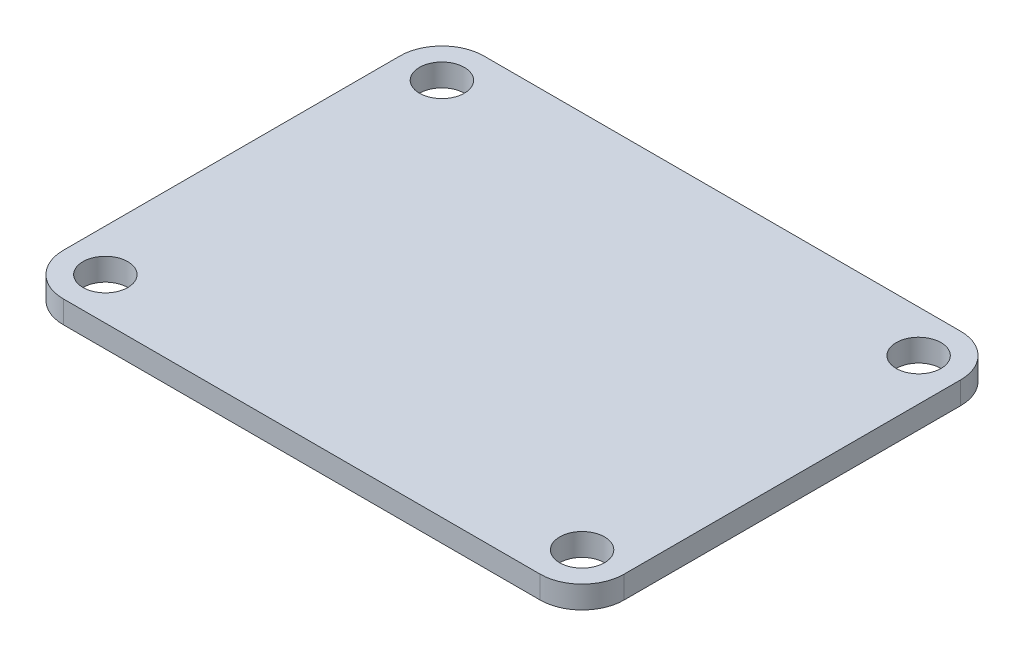
ISO-10303-21;
HEADER;
FILE_DESCRIPTION(('STEP AP214'),'2;1');
FILE_NAME('part.step','',(''),(''),'','','');
FILE_SCHEMA(('AUTOMOTIVE_DESIGN { 1 0 10303 214 1 1 1 1 }'));
ENDSEC;
DATA;
#1=APPLICATION_CONTEXT('core data for automotive mechanical design processes');
#2=APPLICATION_PROTOCOL_DEFINITION('international standard','automotive_design',2000,#1);
#3=PRODUCT_CONTEXT('',#1,'mechanical');
#4=PRODUCT('Part','Part','',(#3));
#5=PRODUCT_RELATED_PRODUCT_CATEGORY('part','',(#4));
#6=PRODUCT_DEFINITION_FORMATION('','',#4);
#7=PRODUCT_DEFINITION_CONTEXT('part definition',#1,'design');
#8=PRODUCT_DEFINITION('design','',#6,#7);
#9=PRODUCT_DEFINITION_SHAPE('','',#8);
#10=(LENGTH_UNIT() NAMED_UNIT(*) SI_UNIT(.MILLI.,.METRE.));
#11=(NAMED_UNIT(*) PLANE_ANGLE_UNIT() SI_UNIT($,.RADIAN.));
#12=(NAMED_UNIT(*) SI_UNIT($,.STERADIAN.) SOLID_ANGLE_UNIT());
#13=UNCERTAINTY_MEASURE_WITH_UNIT(LENGTH_MEASURE(1.E-05),#10,'distance_accuracy_value','');
#14=(GEOMETRIC_REPRESENTATION_CONTEXT(3) GLOBAL_UNCERTAINTY_ASSIGNED_CONTEXT((#13)) GLOBAL_UNIT_ASSIGNED_CONTEXT((#10,
#11,#12)) REPRESENTATION_CONTEXT('',''));
#15=CARTESIAN_POINT('',(0.,0.,0.));
#16=DIRECTION('',(0.,0.,1.));
#17=DIRECTION('',(1.,0.,0.));
#18=AXIS2_PLACEMENT_3D('',#15,#16,#17);
#19=CARTESIAN_POINT('',(-17.,1.6,12.));
#20=DIRECTION('',(0.,1.,0.));
#21=DIRECTION('',(0.,0.,1.));
#22=AXIS2_PLACEMENT_3D('',#19,#20,#21);
#23=PLANE('',#22);
#24=CARTESIAN_POINT('',(17.,1.6,12.));
#25=DIRECTION('',(0.,1.,0.));
#26=DIRECTION('',(0.,0.,1.));
#27=AXIS2_PLACEMENT_3D('',#24,#25,#26);
#28=CIRCLE('',#27,1.6);
#29=CARTESIAN_POINT('',(17.,1.6,13.6));
#30=VERTEX_POINT('',#29);
#31=EDGE_CURVE('E225',#30,#30,#28,.T.);
#32=ORIENTED_EDGE('',*,*,#31,.F.);
#33=EDGE_LOOP('',(#32));
#34=FACE_BOUND('',#33,.T.);
#35=CARTESIAN_POINT('',(-17.,1.6,-12.));
#36=DIRECTION('',(0.,1.,0.));
#37=DIRECTION('',(0.,0.,1.));
#38=AXIS2_PLACEMENT_3D('',#35,#36,#37);
#39=CIRCLE('',#38,1.6);
#40=CARTESIAN_POINT('',(-17.,1.6,-10.4));
#41=VERTEX_POINT('',#40);
#42=EDGE_CURVE('E148',#41,#41,#39,.T.);
#43=ORIENTED_EDGE('',*,*,#42,.F.);
#44=EDGE_LOOP('',(#43));
#45=FACE_BOUND('',#44,.T.);
#46=CARTESIAN_POINT('',(-17.,1.6,12.));
#47=DIRECTION('',(0.,1.,0.));
#48=DIRECTION('',(0.,0.,1.));
#49=AXIS2_PLACEMENT_3D('',#46,#47,#48);
#50=CIRCLE('',#49,3.);
#51=CARTESIAN_POINT('',(-20.,1.6,12.));
#52=VERTEX_POINT('',#51);
#53=CARTESIAN_POINT('',(-17.,1.6,15.));
#54=VERTEX_POINT('',#53);
#55=EDGE_CURVE('E166',#52,#54,#50,.T.);
#56=ORIENTED_EDGE('',*,*,#55,.T.);
#57=DIRECTION('',(1.,0.,0.));
#58=VECTOR('',#57,1.);
#59=CARTESIAN_POINT('',(-17.,1.6,15.));
#60=LINE('',#59,#58);
#61=CARTESIAN_POINT('',(17.,1.6,15.));
#62=VERTEX_POINT('',#61);
#63=EDGE_CURVE('E101',#54,#62,#60,.T.);
#64=ORIENTED_EDGE('',*,*,#63,.T.);
#65=CARTESIAN_POINT('',(17.,1.6,12.));
#66=DIRECTION('',(0.,1.,0.));
#67=DIRECTION('',(0.,0.,1.));
#68=AXIS2_PLACEMENT_3D('',#65,#66,#67);
#69=CIRCLE('',#68,3.);
#70=CARTESIAN_POINT('',(20.,1.6,12.));
#71=VERTEX_POINT('',#70);
#72=EDGE_CURVE('E188',#62,#71,#69,.T.);
#73=ORIENTED_EDGE('',*,*,#72,.T.);
#74=DIRECTION('',(0.,0.,-1.));
#75=VECTOR('',#74,1.);
#76=CARTESIAN_POINT('',(20.,1.6,-12.));
#77=LINE('',#76,#75);
#78=CARTESIAN_POINT('',(20.,1.6,-12.));
#79=VERTEX_POINT('',#78);
#80=EDGE_CURVE('E202',#71,#79,#77,.T.);
#81=ORIENTED_EDGE('',*,*,#80,.T.);
#82=CARTESIAN_POINT('',(17.,1.6,-12.));
#83=DIRECTION('',(0.,1.,0.));
#84=DIRECTION('',(0.,0.,-1.));
#85=AXIS2_PLACEMENT_3D('',#82,#83,#84);
#86=CIRCLE('',#85,3.);
#87=CARTESIAN_POINT('',(17.,1.6,-15.));
#88=VERTEX_POINT('',#87);
#89=EDGE_CURVE('E120',#79,#88,#86,.T.);
#90=ORIENTED_EDGE('',*,*,#89,.T.);
#91=DIRECTION('',(-1.,0.,0.));
#92=VECTOR('',#91,1.);
#93=CARTESIAN_POINT('',(-17.,1.6,-15.));
#94=LINE('',#93,#92);
#95=CARTESIAN_POINT('',(-17.,1.6,-15.));
#96=VERTEX_POINT('',#95);
#97=EDGE_CURVE('E114',#88,#96,#94,.T.);
#98=ORIENTED_EDGE('',*,*,#97,.T.);
#99=CARTESIAN_POINT('',(-17.,1.6,-12.));
#100=DIRECTION('',(0.,1.,0.));
#101=DIRECTION('',(0.,0.,1.));
#102=AXIS2_PLACEMENT_3D('',#99,#100,#101);
#103=CIRCLE('',#102,3.);
#104=CARTESIAN_POINT('',(-20.,1.6,-12.));
#105=VERTEX_POINT('',#104);
#106=EDGE_CURVE('E118',#96,#105,#103,.T.);
#107=ORIENTED_EDGE('',*,*,#106,.T.);
#108=DIRECTION('',(0.,0.,1.));
#109=VECTOR('',#108,1.);
#110=CARTESIAN_POINT('',(-20.,1.6,-12.));
#111=LINE('',#110,#109);
#112=EDGE_CURVE('E58',#105,#52,#111,.T.);
#113=ORIENTED_EDGE('',*,*,#112,.T.);
#114=EDGE_LOOP('',(#56,#64,#73,#81,#90,#98,#107,#113));
#115=FACE_BOUND('',#114,.T.);
#116=CARTESIAN_POINT('',(17.,1.6,-12.));
#117=DIRECTION('',(0.,1.,0.));
#118=DIRECTION('',(0.,0.,1.));
#119=AXIS2_PLACEMENT_3D('',#116,#117,#118);
#120=CIRCLE('',#119,1.6);
#121=CARTESIAN_POINT('',(17.,1.6,-10.4));
#122=VERTEX_POINT('',#121);
#123=EDGE_CURVE('E217',#122,#122,#120,.T.);
#124=ORIENTED_EDGE('',*,*,#123,.F.);
#125=EDGE_LOOP('',(#124));
#126=FACE_BOUND('',#125,.T.);
#127=CARTESIAN_POINT('',(-17.,1.6,12.));
#128=DIRECTION('',(0.,1.,0.));
#129=DIRECTION('',(0.,0.,1.));
#130=AXIS2_PLACEMENT_3D('',#127,#128,#129);
#131=CIRCLE('',#130,1.6);
#132=CARTESIAN_POINT('',(-17.,1.6,13.6));
#133=VERTEX_POINT('',#132);
#134=EDGE_CURVE('E233',#133,#133,#131,.T.);
#135=ORIENTED_EDGE('',*,*,#134,.F.);
#136=EDGE_LOOP('',(#135));
#137=FACE_BOUND('',#136,.T.);
#138=ADVANCED_FACE('F40',(#34,#45,#115,#126,#137),#23,.T.);
#139=CARTESIAN_POINT('',(-17.,0.,12.));
#140=DIRECTION('',(0.,1.,0.));
#141=DIRECTION('',(0.,0.,1.));
#142=AXIS2_PLACEMENT_3D('',#139,#140,#141);
#143=PLANE('',#142);
#144=CARTESIAN_POINT('',(-17.,0.,12.));
#145=DIRECTION('',(0.,1.,0.));
#146=DIRECTION('',(0.,0.,1.));
#147=AXIS2_PLACEMENT_3D('',#144,#145,#146);
#148=CIRCLE('',#147,3.);
#149=CARTESIAN_POINT('',(-20.,0.,12.));
#150=VERTEX_POINT('',#149);
#151=CARTESIAN_POINT('',(-17.,0.,15.));
#152=VERTEX_POINT('',#151);
#153=EDGE_CURVE('E143',#150,#152,#148,.T.);
#154=ORIENTED_EDGE('',*,*,#153,.F.);
#155=DIRECTION('',(0.,0.,1.));
#156=VECTOR('',#155,1.);
#157=CARTESIAN_POINT('',(-20.,0.,-12.));
#158=LINE('',#157,#156);
#159=CARTESIAN_POINT('',(-20.,0.,-12.));
#160=VERTEX_POINT('',#159);
#161=EDGE_CURVE('E93',#160,#150,#158,.T.);
#162=ORIENTED_EDGE('',*,*,#161,.F.);
#163=CARTESIAN_POINT('',(-17.,0.,-12.));
#164=DIRECTION('',(0.,1.,0.));
#165=DIRECTION('',(0.,0.,1.));
#166=AXIS2_PLACEMENT_3D('',#163,#164,#165);
#167=CIRCLE('',#166,3.);
#168=CARTESIAN_POINT('',(-17.,0.,-15.));
#169=VERTEX_POINT('',#168);
#170=EDGE_CURVE('E87',#169,#160,#167,.T.);
#171=ORIENTED_EDGE('',*,*,#170,.F.);
#172=DIRECTION('',(-1.,0.,0.));
#173=VECTOR('',#172,1.);
#174=CARTESIAN_POINT('',(-17.,0.,-15.));
#175=LINE('',#174,#173);
#176=CARTESIAN_POINT('',(17.,0.,-15.));
#177=VERTEX_POINT('',#176);
#178=EDGE_CURVE('E129',#177,#169,#175,.T.);
#179=ORIENTED_EDGE('',*,*,#178,.F.);
#180=CARTESIAN_POINT('',(17.,0.,-12.));
#181=DIRECTION('',(0.,1.,0.));
#182=DIRECTION('',(0.,0.,-1.));
#183=AXIS2_PLACEMENT_3D('',#180,#181,#182);
#184=CIRCLE('',#183,3.);
#185=CARTESIAN_POINT('',(20.,0.,-12.));
#186=VERTEX_POINT('',#185);
#187=EDGE_CURVE('E157',#186,#177,#184,.T.);
#188=ORIENTED_EDGE('',*,*,#187,.F.);
#189=DIRECTION('',(0.,0.,-1.));
#190=VECTOR('',#189,1.);
#191=CARTESIAN_POINT('',(20.,0.,-12.));
#192=LINE('',#191,#190);
#193=CARTESIAN_POINT('',(20.,0.,12.));
#194=VERTEX_POINT('',#193);
#195=EDGE_CURVE('E154',#194,#186,#192,.T.);
#196=ORIENTED_EDGE('',*,*,#195,.F.);
#197=CARTESIAN_POINT('',(17.,0.,12.));
#198=DIRECTION('',(0.,1.,0.));
#199=DIRECTION('',(0.,0.,1.));
#200=AXIS2_PLACEMENT_3D('',#197,#198,#199);
#201=CIRCLE('',#200,3.);
#202=CARTESIAN_POINT('',(17.,0.,15.));
#203=VERTEX_POINT('',#202);
#204=EDGE_CURVE('E151',#203,#194,#201,.T.);
#205=ORIENTED_EDGE('',*,*,#204,.F.);
#206=DIRECTION('',(1.,0.,0.));
#207=VECTOR('',#206,1.);
#208=CARTESIAN_POINT('',(-17.,0.,15.));
#209=LINE('',#208,#207);
#210=EDGE_CURVE('E147',#152,#203,#209,.T.);
#211=ORIENTED_EDGE('',*,*,#210,.F.);
#212=EDGE_LOOP('',(#154,#162,#171,#179,#188,#196,#205,#211));
#213=FACE_BOUND('',#212,.T.);
#214=CARTESIAN_POINT('',(-17.,0.,-12.));
#215=DIRECTION('',(0.,1.,0.));
#216=DIRECTION('',(0.,0.,1.));
#217=AXIS2_PLACEMENT_3D('',#214,#215,#216);
#218=CIRCLE('',#217,1.6);
#219=CARTESIAN_POINT('',(-17.,0.,-10.4));
#220=VERTEX_POINT('',#219);
#221=EDGE_CURVE('E213',#220,#220,#218,.T.);
#222=ORIENTED_EDGE('',*,*,#221,.T.);
#223=EDGE_LOOP('',(#222));
#224=FACE_BOUND('',#223,.T.);
#225=CARTESIAN_POINT('',(17.,0.,-12.));
#226=DIRECTION('',(0.,1.,0.));
#227=DIRECTION('',(0.,0.,1.));
#228=AXIS2_PLACEMENT_3D('',#225,#226,#227);
#229=CIRCLE('',#228,1.6);
#230=CARTESIAN_POINT('',(17.,0.,-10.4));
#231=VERTEX_POINT('',#230);
#232=EDGE_CURVE('E221',#231,#231,#229,.T.);
#233=ORIENTED_EDGE('',*,*,#232,.T.);
#234=EDGE_LOOP('',(#233));
#235=FACE_BOUND('',#234,.T.);
#236=CARTESIAN_POINT('',(17.,0.,12.));
#237=DIRECTION('',(0.,1.,0.));
#238=DIRECTION('',(0.,0.,1.));
#239=AXIS2_PLACEMENT_3D('',#236,#237,#238);
#240=CIRCLE('',#239,1.6);
#241=CARTESIAN_POINT('',(17.,0.,13.6));
#242=VERTEX_POINT('',#241);
#243=EDGE_CURVE('E229',#242,#242,#240,.T.);
#244=ORIENTED_EDGE('',*,*,#243,.T.);
#245=EDGE_LOOP('',(#244));
#246=FACE_BOUND('',#245,.T.);
#247=CARTESIAN_POINT('',(-17.,0.,12.));
#248=DIRECTION('',(0.,1.,0.));
#249=DIRECTION('',(0.,0.,1.));
#250=AXIS2_PLACEMENT_3D('',#247,#248,#249);
#251=CIRCLE('',#250,1.6);
#252=CARTESIAN_POINT('',(-17.,0.,13.6));
#253=VERTEX_POINT('',#252);
#254=EDGE_CURVE('E237',#253,#253,#251,.T.);
#255=ORIENTED_EDGE('',*,*,#254,.T.);
#256=EDGE_LOOP('',(#255));
#257=FACE_BOUND('',#256,.T.);
#258=ADVANCED_FACE('F192',(#213,#224,#235,#246,#257),#143,.F.);
#259=CARTESIAN_POINT('',(-17.,1.6,12.));
#260=DIRECTION('',(0.,-1.,0.));
#261=DIRECTION('',(0.,0.,-1.));
#262=AXIS2_PLACEMENT_3D('',#259,#260,#261);
#263=CYLINDRICAL_SURFACE('',#262,3.);
#264=ORIENTED_EDGE('',*,*,#153,.T.);
#265=DIRECTION('',(0.,-1.,0.));
#266=VECTOR('',#265,1.);
#267=CARTESIAN_POINT('',(-17.,1.6,15.));
#268=LINE('',#267,#266);
#269=EDGE_CURVE('E11',#54,#152,#268,.T.);
#270=ORIENTED_EDGE('',*,*,#269,.F.);
#271=ORIENTED_EDGE('',*,*,#55,.F.);
#272=DIRECTION('',(0.,-1.,0.));
#273=VECTOR('',#272,1.);
#274=CARTESIAN_POINT('',(-20.,1.6,12.));
#275=LINE('',#274,#273);
#276=EDGE_CURVE('E139',#52,#150,#275,.T.);
#277=ORIENTED_EDGE('',*,*,#276,.T.);
#278=EDGE_LOOP('',(#264,#270,#271,#277));
#279=FACE_BOUND('',#278,.T.);
#280=ADVANCED_FACE('F42',(#279),#263,.T.);
#281=CARTESIAN_POINT('',(-17.,1.6,15.));
#282=DIRECTION('',(0.,0.,-1.));
#283=DIRECTION('',(-1.,0.,0.));
#284=AXIS2_PLACEMENT_3D('',#281,#282,#283);
#285=PLANE('',#284);
#286=ORIENTED_EDGE('',*,*,#210,.T.);
#287=DIRECTION('',(0.,-1.,0.));
#288=VECTOR('',#287,1.);
#289=CARTESIAN_POINT('',(17.,1.6,15.));
#290=LINE('',#289,#288);
#291=EDGE_CURVE('E50',#62,#203,#290,.T.);
#292=ORIENTED_EDGE('',*,*,#291,.F.);
#293=ORIENTED_EDGE('',*,*,#63,.F.);
#294=ORIENTED_EDGE('',*,*,#269,.T.);
#295=EDGE_LOOP('',(#286,#292,#293,#294));
#296=FACE_BOUND('',#295,.T.);
#297=ADVANCED_FACE('F274',(#296),#285,.F.);
#298=CARTESIAN_POINT('',(17.,1.6,12.));
#299=DIRECTION('',(0.,-1.,0.));
#300=DIRECTION('',(0.,0.,-1.));
#301=AXIS2_PLACEMENT_3D('',#298,#299,#300);
#302=CYLINDRICAL_SURFACE('',#301,3.);
#303=ORIENTED_EDGE('',*,*,#204,.T.);
#304=DIRECTION('',(0.,-1.,0.));
#305=VECTOR('',#304,1.);
#306=CARTESIAN_POINT('',(20.,1.6,12.));
#307=LINE('',#306,#305);
#308=EDGE_CURVE('E177',#71,#194,#307,.T.);
#309=ORIENTED_EDGE('',*,*,#308,.F.);
#310=ORIENTED_EDGE('',*,*,#72,.F.);
#311=ORIENTED_EDGE('',*,*,#291,.T.);
#312=EDGE_LOOP('',(#303,#309,#310,#311));
#313=FACE_BOUND('',#312,.T.);
#314=ADVANCED_FACE('F186',(#313),#302,.T.);
#315=CARTESIAN_POINT('',(20.,1.6,-12.));
#316=DIRECTION('',(-1.,0.,0.));
#317=DIRECTION('',(0.,0.,1.));
#318=AXIS2_PLACEMENT_3D('',#315,#316,#317);
#319=PLANE('',#318);
#320=ORIENTED_EDGE('',*,*,#195,.T.);
#321=DIRECTION('',(0.,-1.,0.));
#322=VECTOR('',#321,1.);
#323=CARTESIAN_POINT('',(20.,1.6,-12.));
#324=LINE('',#323,#322);
#325=EDGE_CURVE('E173',#79,#186,#324,.T.);
#326=ORIENTED_EDGE('',*,*,#325,.F.);
#327=ORIENTED_EDGE('',*,*,#80,.F.);
#328=ORIENTED_EDGE('',*,*,#308,.T.);
#329=EDGE_LOOP('',(#320,#326,#327,#328));
#330=FACE_BOUND('',#329,.T.);
#331=ADVANCED_FACE('F197',(#330),#319,.F.);
#332=CARTESIAN_POINT('',(17.,1.6,-12.));
#333=DIRECTION('',(0.,-1.,0.));
#334=DIRECTION('',(0.,0.,-1.));
#335=AXIS2_PLACEMENT_3D('',#332,#333,#334);
#336=CYLINDRICAL_SURFACE('',#335,3.);
#337=ORIENTED_EDGE('',*,*,#187,.T.);
#338=DIRECTION('',(0.,-1.,0.));
#339=VECTOR('',#338,1.);
#340=CARTESIAN_POINT('',(17.,1.6,-15.));
#341=LINE('',#340,#339);
#342=EDGE_CURVE('E131',#88,#177,#341,.T.);
#343=ORIENTED_EDGE('',*,*,#342,.F.);
#344=ORIENTED_EDGE('',*,*,#89,.F.);
#345=ORIENTED_EDGE('',*,*,#325,.T.);
#346=EDGE_LOOP('',(#337,#343,#344,#345));
#347=FACE_BOUND('',#346,.T.);
#348=ADVANCED_FACE('F200',(#347),#336,.T.);
#349=CARTESIAN_POINT('',(-17.,1.6,-15.));
#350=DIRECTION('',(0.,0.,1.));
#351=DIRECTION('',(1.,0.,0.));
#352=AXIS2_PLACEMENT_3D('',#349,#350,#351);
#353=PLANE('',#352);
#354=ORIENTED_EDGE('',*,*,#178,.T.);
#355=DIRECTION('',(0.,-1.,0.));
#356=VECTOR('',#355,1.);
#357=CARTESIAN_POINT('',(-17.,1.6,-15.));
#358=LINE('',#357,#356);
#359=EDGE_CURVE('E126',#96,#169,#358,.T.);
#360=ORIENTED_EDGE('',*,*,#359,.F.);
#361=ORIENTED_EDGE('',*,*,#97,.F.);
#362=ORIENTED_EDGE('',*,*,#342,.T.);
#363=EDGE_LOOP('',(#354,#360,#361,#362));
#364=FACE_BOUND('',#363,.T.);
#365=ADVANCED_FACE('F127',(#364),#353,.F.);
#366=CARTESIAN_POINT('',(-17.,1.6,-12.));
#367=DIRECTION('',(0.,-1.,0.));
#368=DIRECTION('',(0.,0.,-1.));
#369=AXIS2_PLACEMENT_3D('',#366,#367,#368);
#370=CYLINDRICAL_SURFACE('',#369,3.);
#371=ORIENTED_EDGE('',*,*,#170,.T.);
#372=DIRECTION('',(0.,-1.,0.));
#373=VECTOR('',#372,1.);
#374=CARTESIAN_POINT('',(-20.,1.6,-12.));
#375=LINE('',#374,#373);
#376=EDGE_CURVE('E132',#105,#160,#375,.T.);
#377=ORIENTED_EDGE('',*,*,#376,.F.);
#378=ORIENTED_EDGE('',*,*,#106,.F.);
#379=ORIENTED_EDGE('',*,*,#359,.T.);
#380=EDGE_LOOP('',(#371,#377,#378,#379));
#381=FACE_BOUND('',#380,.T.);
#382=ADVANCED_FACE('F134',(#381),#370,.T.);
#383=CARTESIAN_POINT('',(-20.,1.6,-12.));
#384=DIRECTION('',(1.,0.,0.));
#385=DIRECTION('',(0.,0.,-1.));
#386=AXIS2_PLACEMENT_3D('',#383,#384,#385);
#387=PLANE('',#386);
#388=ORIENTED_EDGE('',*,*,#161,.T.);
#389=ORIENTED_EDGE('',*,*,#276,.F.);
#390=ORIENTED_EDGE('',*,*,#112,.F.);
#391=ORIENTED_EDGE('',*,*,#376,.T.);
#392=EDGE_LOOP('',(#388,#389,#390,#391));
#393=FACE_BOUND('',#392,.T.);
#394=ADVANCED_FACE('F262',(#393),#387,.F.);
#395=CARTESIAN_POINT('',(-17.,1.6,-12.));
#396=DIRECTION('',(0.,-1.,0.));
#397=DIRECTION('',(0.,0.,-1.));
#398=AXIS2_PLACEMENT_3D('',#395,#396,#397);
#399=CYLINDRICAL_SURFACE('',#398,1.6);
#400=ORIENTED_EDGE('',*,*,#42,.T.);
#401=EDGE_LOOP('',(#400));
#402=FACE_BOUND('',#401,.T.);
#403=ORIENTED_EDGE('',*,*,#221,.F.);
#404=EDGE_LOOP('',(#403));
#405=FACE_BOUND('',#404,.T.);
#406=ADVANCED_FACE('F259',(#402,#405),#399,.F.);
#407=CARTESIAN_POINT('',(17.,1.6,-12.));
#408=DIRECTION('',(0.,-1.,0.));
#409=DIRECTION('',(0.,0.,-1.));
#410=AXIS2_PLACEMENT_3D('',#407,#408,#409);
#411=CYLINDRICAL_SURFACE('',#410,1.6);
#412=ORIENTED_EDGE('',*,*,#123,.T.);
#413=EDGE_LOOP('',(#412));
#414=FACE_BOUND('',#413,.T.);
#415=ORIENTED_EDGE('',*,*,#232,.F.);
#416=EDGE_LOOP('',(#415));
#417=FACE_BOUND('',#416,.T.);
#418=ADVANCED_FACE('F350',(#414,#417),#411,.F.);
#419=CARTESIAN_POINT('',(17.,1.6,12.));
#420=DIRECTION('',(0.,-1.,0.));
#421=DIRECTION('',(0.,0.,-1.));
#422=AXIS2_PLACEMENT_3D('',#419,#420,#421);
#423=CYLINDRICAL_SURFACE('',#422,1.6);
#424=ORIENTED_EDGE('',*,*,#31,.T.);
#425=EDGE_LOOP('',(#424));
#426=FACE_BOUND('',#425,.T.);
#427=ORIENTED_EDGE('',*,*,#243,.F.);
#428=EDGE_LOOP('',(#427));
#429=FACE_BOUND('',#428,.T.);
#430=ADVANCED_FACE('F359',(#426,#429),#423,.F.);
#431=CARTESIAN_POINT('',(-17.,1.6,12.));
#432=DIRECTION('',(0.,-1.,0.));
#433=DIRECTION('',(0.,0.,-1.));
#434=AXIS2_PLACEMENT_3D('',#431,#432,#433);
#435=CYLINDRICAL_SURFACE('',#434,1.6);
#436=ORIENTED_EDGE('',*,*,#134,.T.);
#437=EDGE_LOOP('',(#436));
#438=FACE_BOUND('',#437,.T.);
#439=ORIENTED_EDGE('',*,*,#254,.F.);
#440=EDGE_LOOP('',(#439));
#441=FACE_BOUND('',#440,.T.);
#442=ADVANCED_FACE('F246',(#438,#441),#435,.F.);
#443=CLOSED_SHELL('',(#138,#258,#280,#297,#314,#331,#348,#365,#382,#394,#406,#418,#430,#442));
#444=MANIFOLD_SOLID_BREP('B2',#443);
#445=ADVANCED_BREP_SHAPE_REPRESENTATION('',(#18,#444),#14);
#446=SHAPE_DEFINITION_REPRESENTATION(#9,#445);
ENDSEC;
END-ISO-10303-21;
